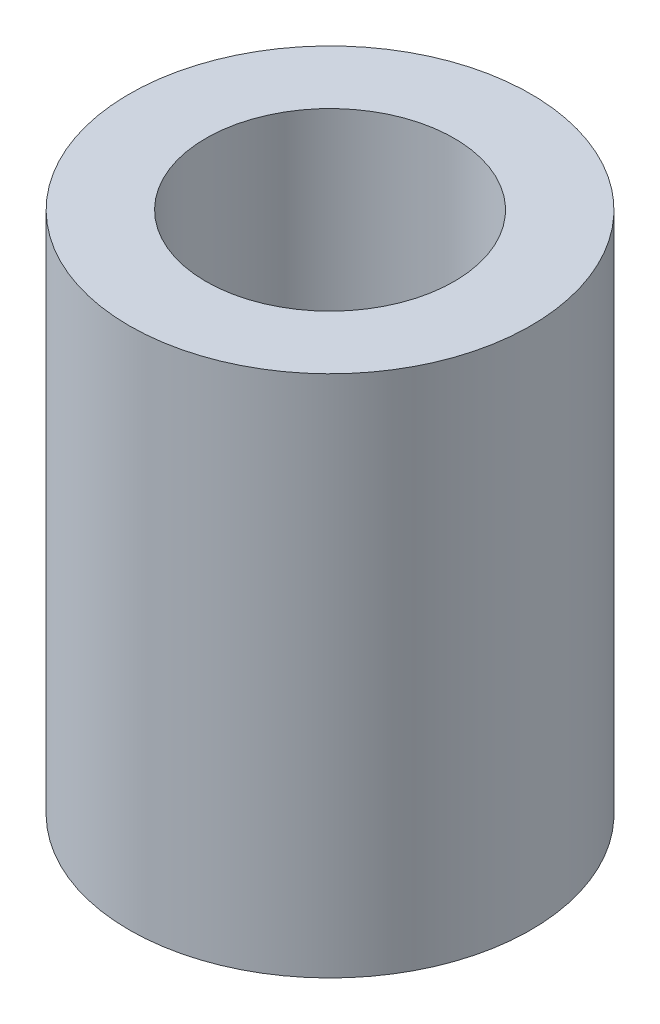
ISO-10303-21;
HEADER;
FILE_DESCRIPTION(('STEP AP214'),'2;1');
FILE_NAME('part.step','',(''),(''),'','','');
FILE_SCHEMA(('AUTOMOTIVE_DESIGN { 1 0 10303 214 1 1 1 1 }'));
ENDSEC;
DATA;
#1=APPLICATION_CONTEXT('core data for automotive mechanical design processes');
#2=APPLICATION_PROTOCOL_DEFINITION('international standard','automotive_design',2000,#1);
#3=PRODUCT_CONTEXT('',#1,'mechanical');
#4=PRODUCT('Part','Part','',(#3));
#5=PRODUCT_RELATED_PRODUCT_CATEGORY('part','',(#4));
#6=PRODUCT_DEFINITION_FORMATION('','',#4);
#7=PRODUCT_DEFINITION_CONTEXT('part definition',#1,'design');
#8=PRODUCT_DEFINITION('design','',#6,#7);
#9=PRODUCT_DEFINITION_SHAPE('','',#8);
#10=(LENGTH_UNIT() NAMED_UNIT(*) SI_UNIT(.MILLI.,.METRE.));
#11=(NAMED_UNIT(*) PLANE_ANGLE_UNIT() SI_UNIT($,.RADIAN.));
#12=(NAMED_UNIT(*) SI_UNIT($,.STERADIAN.) SOLID_ANGLE_UNIT());
#13=UNCERTAINTY_MEASURE_WITH_UNIT(LENGTH_MEASURE(1.E-05),#10,'distance_accuracy_value','');
#14=(GEOMETRIC_REPRESENTATION_CONTEXT(3) GLOBAL_UNCERTAINTY_ASSIGNED_CONTEXT((#13)) GLOBAL_UNIT_ASSIGNED_CONTEXT((#10,
#11,#12)) REPRESENTATION_CONTEXT('',''));
#15=CARTESIAN_POINT('',(0.,0.,0.));
#16=DIRECTION('',(0.,0.,1.));
#17=DIRECTION('',(1.,0.,0.));
#18=AXIS2_PLACEMENT_3D('',#15,#16,#17);
#19=CARTESIAN_POINT('',(0.,13.65,0.));
#20=DIRECTION('',(0.,1.,0.));
#21=DIRECTION('',(0.,0.,1.));
#22=AXIS2_PLACEMENT_3D('',#19,#20,#21);
#23=PLANE('',#22);
#24=CARTESIAN_POINT('',(0.,13.65,0.));
#25=DIRECTION('',(0.,1.,0.));
#26=DIRECTION('',(0.,0.,1.));
#27=AXIS2_PLACEMENT_3D('',#24,#25,#26);
#28=CIRCLE('',#27,5.2375);
#29=CARTESIAN_POINT('',(0.,13.65,5.2375));
#30=VERTEX_POINT('',#29);
#31=EDGE_CURVE('E11',#30,#30,#28,.T.);
#32=ORIENTED_EDGE('',*,*,#31,.T.);
#33=EDGE_LOOP('',(#32));
#34=FACE_BOUND('',#33,.T.);
#35=CARTESIAN_POINT('',(0.,13.65,0.));
#36=DIRECTION('',(0.,1.,0.));
#37=DIRECTION('',(0.,0.,1.));
#38=AXIS2_PLACEMENT_3D('',#35,#36,#37);
#39=CIRCLE('',#38,3.2375);
#40=CARTESIAN_POINT('',(0.,13.65,3.2375));
#41=VERTEX_POINT('',#40);
#42=EDGE_CURVE('E52',#41,#41,#39,.T.);
#43=ORIENTED_EDGE('',*,*,#42,.F.);
#44=EDGE_LOOP('',(#43));
#45=FACE_BOUND('',#44,.T.);
#46=ADVANCED_FACE('F41',(#34,#45),#23,.T.);
#47=CARTESIAN_POINT('',(0.,0.,0.));
#48=DIRECTION('',(0.,1.,0.));
#49=DIRECTION('',(0.,0.,1.));
#50=AXIS2_PLACEMENT_3D('',#47,#48,#49);
#51=PLANE('',#50);
#52=CARTESIAN_POINT('',(0.,0.,0.));
#53=DIRECTION('',(0.,1.,0.));
#54=DIRECTION('',(0.,0.,1.));
#55=AXIS2_PLACEMENT_3D('',#52,#53,#54);
#56=CIRCLE('',#55,5.2375);
#57=CARTESIAN_POINT('',(0.,0.,5.2375));
#58=VERTEX_POINT('',#57);
#59=EDGE_CURVE('E45',#58,#58,#56,.T.);
#60=ORIENTED_EDGE('',*,*,#59,.F.);
#61=EDGE_LOOP('',(#60));
#62=FACE_BOUND('',#61,.T.);
#63=CARTESIAN_POINT('',(0.,0.,0.));
#64=DIRECTION('',(0.,1.,0.));
#65=DIRECTION('',(0.,0.,1.));
#66=AXIS2_PLACEMENT_3D('',#63,#64,#65);
#67=CIRCLE('',#66,3.2375);
#68=CARTESIAN_POINT('',(0.,0.,3.2375));
#69=VERTEX_POINT('',#68);
#70=EDGE_CURVE('E54',#69,#69,#67,.T.);
#71=ORIENTED_EDGE('',*,*,#70,.T.);
#72=EDGE_LOOP('',(#71));
#73=FACE_BOUND('',#72,.T.);
#74=ADVANCED_FACE('F64',(#62,#73),#51,.F.);
#75=CARTESIAN_POINT('',(0.,13.65,0.));
#76=DIRECTION('',(0.,-1.,0.));
#77=DIRECTION('',(0.,0.,-1.));
#78=AXIS2_PLACEMENT_3D('',#75,#76,#77);
#79=CYLINDRICAL_SURFACE('',#78,5.2375);
#80=ORIENTED_EDGE('',*,*,#31,.F.);
#81=EDGE_LOOP('',(#80));
#82=FACE_BOUND('',#81,.T.);
#83=ORIENTED_EDGE('',*,*,#59,.T.);
#84=EDGE_LOOP('',(#83));
#85=FACE_BOUND('',#84,.T.);
#86=ADVANCED_FACE('F43',(#82,#85),#79,.T.);
#87=CARTESIAN_POINT('',(0.,13.65,0.));
#88=DIRECTION('',(0.,-1.,0.));
#89=DIRECTION('',(0.,0.,-1.));
#90=AXIS2_PLACEMENT_3D('',#87,#88,#89);
#91=CYLINDRICAL_SURFACE('',#90,3.2375);
#92=ORIENTED_EDGE('',*,*,#42,.T.);
#93=EDGE_LOOP('',(#92));
#94=FACE_BOUND('',#93,.T.);
#95=ORIENTED_EDGE('',*,*,#70,.F.);
#96=EDGE_LOOP('',(#95));
#97=FACE_BOUND('',#96,.T.);
#98=ADVANCED_FACE('F60',(#94,#97),#91,.F.);
#99=CLOSED_SHELL('',(#46,#74,#86,#98));
#100=MANIFOLD_SOLID_BREP('B2',#99);
#101=ADVANCED_BREP_SHAPE_REPRESENTATION('',(#18,#100),#14);
#102=SHAPE_DEFINITION_REPRESENTATION(#9,#101);
ENDSEC;
END-ISO-10303-21;
